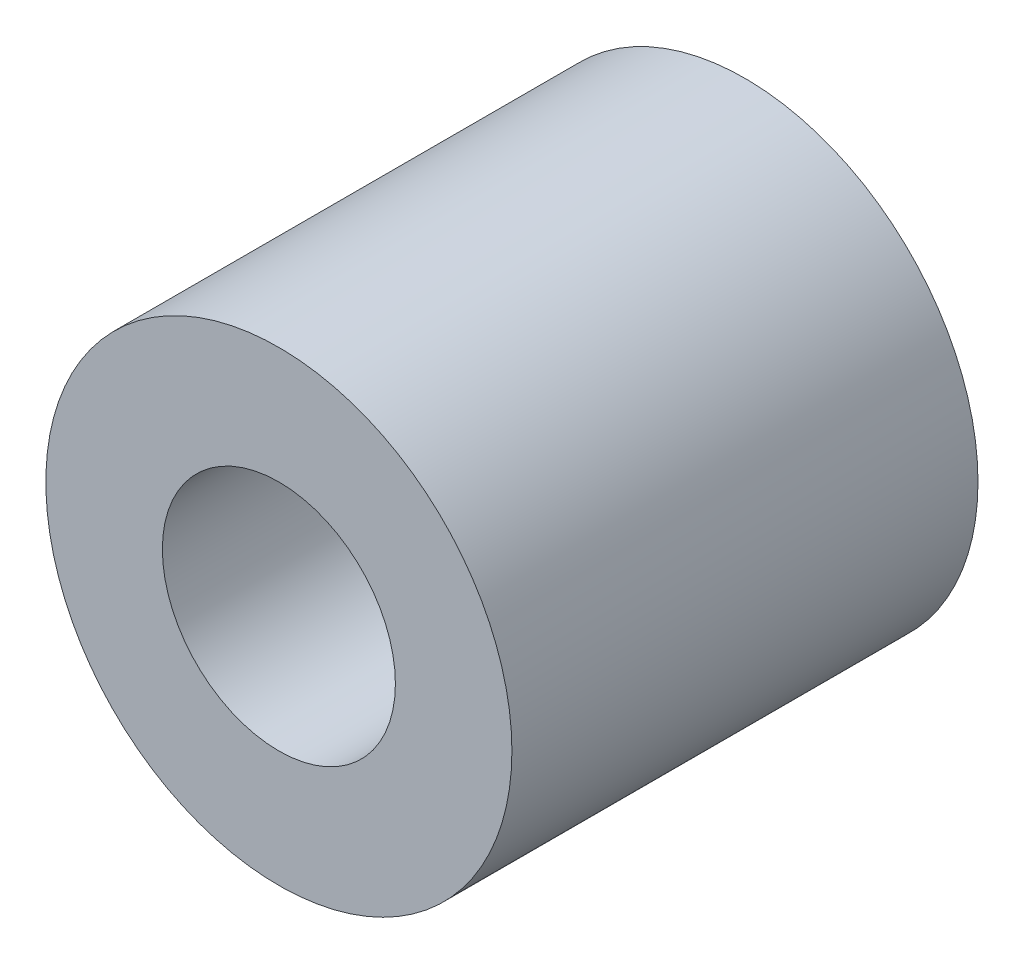
ISO-10303-21;
HEADER;
FILE_DESCRIPTION(('STEP AP214'),'2;1');
FILE_NAME('part.step','',(''),(''),'','','');
FILE_SCHEMA(('AUTOMOTIVE_DESIGN { 1 0 10303 214 1 1 1 1 }'));
ENDSEC;
DATA;
#1=APPLICATION_CONTEXT('core data for automotive mechanical design processes');
#2=APPLICATION_PROTOCOL_DEFINITION('international standard','automotive_design',2000,#1);
#3=PRODUCT_CONTEXT('',#1,'mechanical');
#4=PRODUCT('Part','Part','',(#3));
#5=PRODUCT_RELATED_PRODUCT_CATEGORY('part','',(#4));
#6=PRODUCT_DEFINITION_FORMATION('','',#4);
#7=PRODUCT_DEFINITION_CONTEXT('part definition',#1,'design');
#8=PRODUCT_DEFINITION('design','',#6,#7);
#9=PRODUCT_DEFINITION_SHAPE('','',#8);
#10=(LENGTH_UNIT() NAMED_UNIT(*) SI_UNIT(.MILLI.,.METRE.));
#11=(NAMED_UNIT(*) PLANE_ANGLE_UNIT() SI_UNIT($,.RADIAN.));
#12=(NAMED_UNIT(*) SI_UNIT($,.STERADIAN.) SOLID_ANGLE_UNIT());
#13=UNCERTAINTY_MEASURE_WITH_UNIT(LENGTH_MEASURE(1.E-05),#10,'distance_accuracy_value','');
#14=(GEOMETRIC_REPRESENTATION_CONTEXT(3) GLOBAL_UNCERTAINTY_ASSIGNED_CONTEXT((#13)) GLOBAL_UNIT_ASSIGNED_CONTEXT((#10,
#11,#12)) REPRESENTATION_CONTEXT('',''));
#15=CARTESIAN_POINT('',(0.,0.,0.));
#16=DIRECTION('',(0.,0.,1.));
#17=DIRECTION('',(1.,0.,0.));
#18=AXIS2_PLACEMENT_3D('',#15,#16,#17);
#19=CARTESIAN_POINT('',(0.,0.,16.));
#20=DIRECTION('',(0.,0.,-1.));
#21=DIRECTION('',(-1.,0.,0.));
#22=AXIS2_PLACEMENT_3D('',#19,#20,#21);
#23=CYLINDRICAL_SURFACE('',#22,2.5);
#24=CARTESIAN_POINT('',(0.,0.,0.));
#25=DIRECTION('',(0.,0.,-1.));
#26=DIRECTION('',(-1.,0.,0.));
#27=AXIS2_PLACEMENT_3D('',#24,#25,#26);
#28=CIRCLE('',#27,2.5);
#29=CARTESIAN_POINT('',(-2.5,0.,0.));
#30=VERTEX_POINT('',#29);
#31=EDGE_CURVE('E50',#30,#30,#28,.T.);
#32=ORIENTED_EDGE('',*,*,#31,.T.);
#33=EDGE_LOOP('',(#32));
#34=FACE_BOUND('',#33,.T.);
#35=CARTESIAN_POINT('',(0.,0.,8.));
#36=DIRECTION('',(0.,0.,1.));
#37=DIRECTION('',(1.,0.,0.));
#38=AXIS2_PLACEMENT_3D('',#35,#36,#37);
#39=CIRCLE('',#38,2.5);
#40=CARTESIAN_POINT('',(2.5,0.,8.));
#41=VERTEX_POINT('',#40);
#42=EDGE_CURVE('E41',#41,#41,#39,.F.);
#43=ORIENTED_EDGE('',*,*,#42,.F.);
#44=EDGE_LOOP('',(#43));
#45=FACE_BOUND('',#44,.T.);
#46=ADVANCED_FACE('F37',(#34,#45),#23,.F.);
#47=CARTESIAN_POINT('',(0.,0.,16.));
#48=DIRECTION('',(0.,0.,-1.));
#49=DIRECTION('',(-1.,0.,0.));
#50=AXIS2_PLACEMENT_3D('',#47,#48,#49);
#51=CYLINDRICAL_SURFACE('',#50,8.);
#52=CARTESIAN_POINT('',(0.,0.,16.));
#53=DIRECTION('',(0.,0.,1.));
#54=DIRECTION('',(1.,0.,0.));
#55=AXIS2_PLACEMENT_3D('',#52,#53,#54);
#56=CIRCLE('',#55,8.);
#57=CARTESIAN_POINT('',(8.,0.,16.));
#58=VERTEX_POINT('',#57);
#59=EDGE_CURVE('E10',#58,#58,#56,.T.);
#60=ORIENTED_EDGE('',*,*,#59,.F.);
#61=EDGE_LOOP('',(#60));
#62=FACE_BOUND('',#61,.T.);
#63=CARTESIAN_POINT('',(0.,0.,0.));
#64=DIRECTION('',(0.,0.,1.));
#65=DIRECTION('',(1.,0.,0.));
#66=AXIS2_PLACEMENT_3D('',#63,#64,#65);
#67=CIRCLE('',#66,8.);
#68=CARTESIAN_POINT('',(8.,0.,0.));
#69=VERTEX_POINT('',#68);
#70=EDGE_CURVE('E45',#69,#69,#67,.T.);
#71=ORIENTED_EDGE('',*,*,#70,.T.);
#72=EDGE_LOOP('',(#71));
#73=FACE_BOUND('',#72,.T.);
#74=ADVANCED_FACE('F39',(#62,#73),#51,.T.);
#75=CARTESIAN_POINT('',(0.,0.,16.));
#76=DIRECTION('',(0.,0.,1.));
#77=DIRECTION('',(1.,0.,0.));
#78=AXIS2_PLACEMENT_3D('',#75,#76,#77);
#79=PLANE('',#78);
#80=CARTESIAN_POINT('',(0.,0.,16.));
#81=DIRECTION('',(0.,0.,1.));
#82=DIRECTION('',(1.,0.,0.));
#83=AXIS2_PLACEMENT_3D('',#80,#81,#82);
#84=CIRCLE('',#83,4.);
#85=CARTESIAN_POINT('',(4.,0.,16.));
#86=VERTEX_POINT('',#85);
#87=EDGE_CURVE('E54',#86,#86,#84,.T.);
#88=ORIENTED_EDGE('',*,*,#87,.F.);
#89=EDGE_LOOP('',(#88));
#90=FACE_BOUND('',#89,.T.);
#91=ORIENTED_EDGE('',*,*,#59,.T.);
#92=EDGE_LOOP('',(#91));
#93=FACE_BOUND('',#92,.T.);
#94=ADVANCED_FACE('F74',(#90,#93),#79,.T.);
#95=CARTESIAN_POINT('',(0.,0.,0.));
#96=DIRECTION('',(0.,0.,1.));
#97=DIRECTION('',(1.,0.,0.));
#98=AXIS2_PLACEMENT_3D('',#95,#96,#97);
#99=PLANE('',#98);
#100=ORIENTED_EDGE('',*,*,#31,.F.);
#101=EDGE_LOOP('',(#100));
#102=FACE_BOUND('',#101,.T.);
#103=ORIENTED_EDGE('',*,*,#70,.F.);
#104=EDGE_LOOP('',(#103));
#105=FACE_BOUND('',#104,.T.);
#106=ADVANCED_FACE('F80',(#102,#105),#99,.F.);
#107=CARTESIAN_POINT('',(0.,0.,8.));
#108=DIRECTION('',(0.,0.,1.));
#109=DIRECTION('',(1.,0.,0.));
#110=AXIS2_PLACEMENT_3D('',#107,#108,#109);
#111=PLANE('',#110);
#112=CARTESIAN_POINT('',(0.,0.,8.));
#113=DIRECTION('',(0.,0.,1.));
#114=DIRECTION('',(1.,0.,0.));
#115=AXIS2_PLACEMENT_3D('',#112,#113,#114);
#116=CIRCLE('',#115,4.);
#117=CARTESIAN_POINT('',(4.,0.,8.));
#118=VERTEX_POINT('',#117);
#119=EDGE_CURVE('E57',#118,#118,#116,.T.);
#120=ORIENTED_EDGE('',*,*,#119,.T.);
#121=EDGE_LOOP('',(#120));
#122=FACE_BOUND('',#121,.T.);
#123=ORIENTED_EDGE('',*,*,#42,.T.);
#124=EDGE_LOOP('',(#123));
#125=FACE_BOUND('',#124,.T.);
#126=ADVANCED_FACE('F64',(#122,#125),#111,.T.);
#127=CARTESIAN_POINT('',(0.,0.,8.));
#128=DIRECTION('',(0.,0.,1.));
#129=DIRECTION('',(1.,0.,0.));
#130=AXIS2_PLACEMENT_3D('',#127,#128,#129);
#131=CYLINDRICAL_SURFACE('',#130,4.);
#132=ORIENTED_EDGE('',*,*,#119,.F.);
#133=EDGE_LOOP('',(#132));
#134=FACE_BOUND('',#133,.T.);
#135=ORIENTED_EDGE('',*,*,#87,.T.);
#136=EDGE_LOOP('',(#135));
#137=FACE_BOUND('',#136,.T.);
#138=ADVANCED_FACE('F78',(#134,#137),#131,.F.);
#139=CLOSED_SHELL('',(#46,#74,#94,#106,#126,#138));
#140=MANIFOLD_SOLID_BREP('B2',#139);
#141=ADVANCED_BREP_SHAPE_REPRESENTATION('',(#18,#140),#14);
#142=SHAPE_DEFINITION_REPRESENTATION(#9,#141);
ENDSEC;
END-ISO-10303-21;
